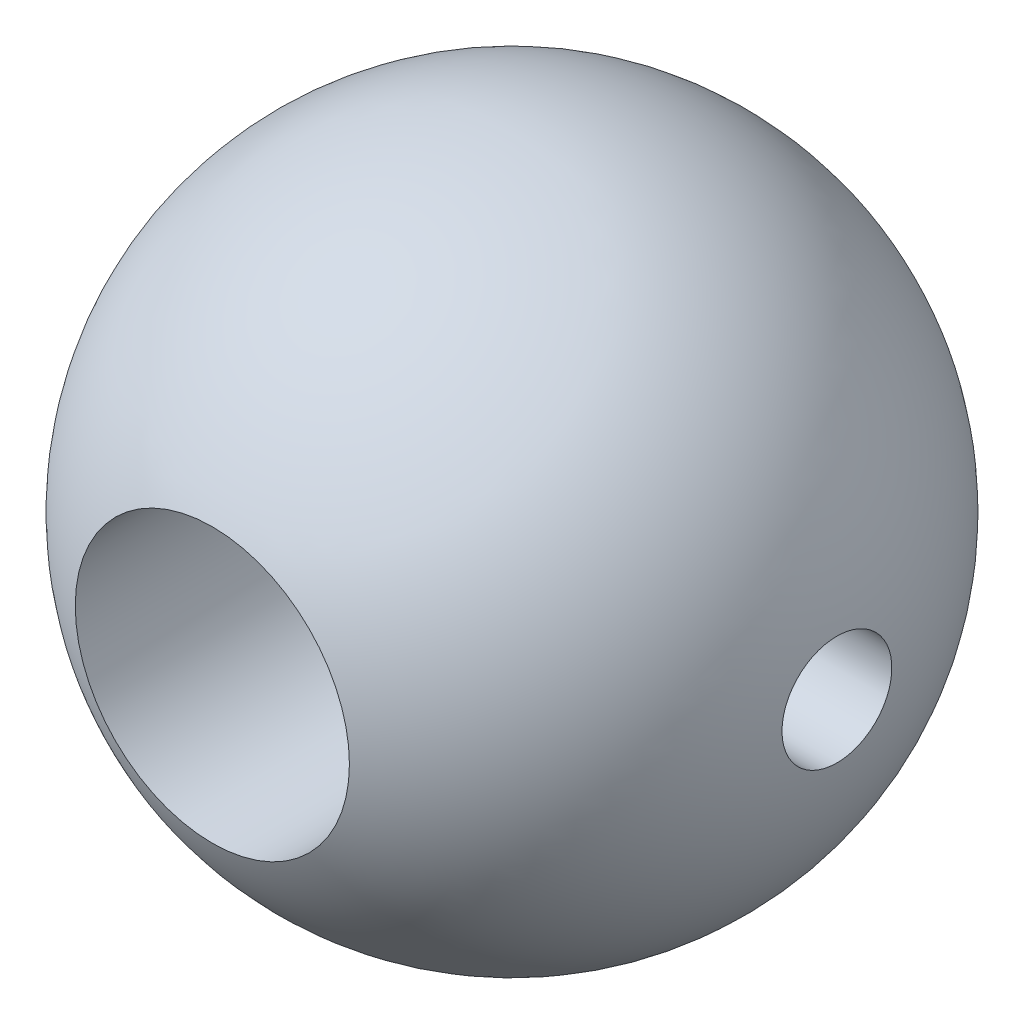
ISO-10303-21;
HEADER;
FILE_DESCRIPTION(('STEP AP214'),'2;1');
FILE_NAME('part.step','',(''),(''),'','','');
FILE_SCHEMA(('AUTOMOTIVE_DESIGN { 1 0 10303 214 1 1 1 1 }'));
ENDSEC;
DATA;
#1=APPLICATION_CONTEXT('core data for automotive mechanical design processes');
#2=APPLICATION_PROTOCOL_DEFINITION('international standard','automotive_design',2000,#1);
#3=PRODUCT_CONTEXT('',#1,'mechanical');
#4=PRODUCT('Part','Part','',(#3));
#5=PRODUCT_RELATED_PRODUCT_CATEGORY('part','',(#4));
#6=PRODUCT_DEFINITION_FORMATION('','',#4);
#7=PRODUCT_DEFINITION_CONTEXT('part definition',#1,'design');
#8=PRODUCT_DEFINITION('design','',#6,#7);
#9=PRODUCT_DEFINITION_SHAPE('','',#8);
#10=(LENGTH_UNIT() NAMED_UNIT(*) SI_UNIT(.MILLI.,.METRE.));
#11=(NAMED_UNIT(*) PLANE_ANGLE_UNIT() SI_UNIT($,.RADIAN.));
#12=(NAMED_UNIT(*) SI_UNIT($,.STERADIAN.) SOLID_ANGLE_UNIT());
#13=UNCERTAINTY_MEASURE_WITH_UNIT(LENGTH_MEASURE(1.E-05),#10,'distance_accuracy_value','');
#14=(GEOMETRIC_REPRESENTATION_CONTEXT(3) GLOBAL_UNCERTAINTY_ASSIGNED_CONTEXT((#13)) GLOBAL_UNIT_ASSIGNED_CONTEXT((#10,
#11,#12)) REPRESENTATION_CONTEXT('',''));
#15=CARTESIAN_POINT('',(0.,0.,0.));
#16=DIRECTION('',(0.,0.,1.));
#17=DIRECTION('',(1.,0.,0.));
#18=AXIS2_PLACEMENT_3D('',#15,#16,#17);
#19=CARTESIAN_POINT('',(0.,0.,0.));
#20=DIRECTION('',(0.,0.,-1.));
#21=DIRECTION('',(1.,0.,0.));
#22=AXIS2_PLACEMENT_3D('',#19,#20,#21);
#23=SPHERICAL_SURFACE('',#22,9.525);
#24=CARTESIAN_POINT('',(0.,0.,-8.66169794208965));
#25=DIRECTION('',(0.,0.,-1.));
#26=DIRECTION('',(-1.,0.,0.));
#27=AXIS2_PLACEMENT_3D('',#24,#25,#26);
#28=CIRCLE('',#27,3.9624);
#29=CARTESIAN_POINT('',(-3.9624,0.,-8.66169794208965));
#30=VERTEX_POINT('',#29);
#31=EDGE_CURVE('E10',#30,#30,#28,.T.);
#32=ORIENTED_EDGE('',*,*,#31,.F.);
#33=EDGE_LOOP('',(#32));
#34=FACE_BOUND('',#33,.T.);
#35=CARTESIAN_POINT('',(0.,0.,8.66169794208965));
#36=DIRECTION('',(0.,0.,-1.));
#37=DIRECTION('',(-1.,0.,0.));
#38=AXIS2_PLACEMENT_3D('',#35,#36,#37);
#39=CIRCLE('',#38,3.9624);
#40=CARTESIAN_POINT('',(-3.9624,0.,8.66169794208965));
#41=VERTEX_POINT('',#40);
#42=EDGE_CURVE('E48',#41,#41,#39,.T.);
#43=ORIENTED_EDGE('',*,*,#42,.T.);
#44=EDGE_LOOP('',(#43));
#45=FACE_BOUND('',#44,.T.);
#46=CARTESIAN_POINT('',(9.39177665567064,0.,0.));
#47=DIRECTION('',(-1.,0.,0.));
#48=DIRECTION('',(0.,0.,1.));
#49=AXIS2_PLACEMENT_3D('',#46,#47,#48);
#50=CIRCLE('',#49,1.5875);
#51=CARTESIAN_POINT('',(9.39177665567064,0.,1.5875));
#52=VERTEX_POINT('',#51);
#53=EDGE_CURVE('E87',#52,#52,#50,.F.);
#54=ORIENTED_EDGE('',*,*,#53,.F.);
#55=EDGE_LOOP('',(#54));
#56=FACE_BOUND('',#55,.T.);
#57=CARTESIAN_POINT('',(-9.39177665567064,0.,0.));
#58=DIRECTION('',(1.,0.,0.));
#59=DIRECTION('',(0.,0.,-1.));
#60=AXIS2_PLACEMENT_3D('',#57,#58,#59);
#61=CIRCLE('',#60,1.5875);
#62=CARTESIAN_POINT('',(-9.39177665567064,0.,-1.5875));
#63=VERTEX_POINT('',#62);
#64=EDGE_CURVE('E53',#63,#63,#61,.F.);
#65=ORIENTED_EDGE('',*,*,#64,.F.);
#66=EDGE_LOOP('',(#65));
#67=FACE_BOUND('',#66,.T.);
#68=ADVANCED_FACE('F37',(#34,#45,#56,#67),#23,.T.);
#69=CARTESIAN_POINT('',(0.,0.,-15.8555400958297));
#70=DIRECTION('',(0.,0.,-1.));
#71=DIRECTION('',(-1.,0.,0.));
#72=AXIS2_PLACEMENT_3D('',#69,#70,#71);
#73=CYLINDRICAL_SURFACE('',#72,3.9624);
#74=ORIENTED_EDGE('',*,*,#42,.F.);
#75=EDGE_LOOP('',(#74));
#76=FACE_BOUND('',#75,.T.);
#77=ORIENTED_EDGE('',*,*,#31,.T.);
#78=EDGE_LOOP('',(#77));
#79=FACE_BOUND('',#78,.T.);
#80=CARTESIAN_POINT('',(3.9624,0.,1.5875));
#81=CARTESIAN_POINT('',(3.96239416664373,0.0853117270718673,1.58749211930106));
#82=CARTESIAN_POINT('',(3.95961253187258,0.170771012783032,1.58058204726005));
#83=CARTESIAN_POINT('',(3.94875664272095,0.339280209794605,1.55318133192485));
#84=CARTESIAN_POINT('',(3.94066802223273,0.422322940365625,1.53265382430656));
#85=CARTESIAN_POINT('',(3.92006972049318,0.58328993969218,1.47888529051547));
#86=CARTESIAN_POINT('',(3.90757454272001,0.661230017057729,1.44568594252038));
#87=CARTESIAN_POINT('',(3.87939329710751,0.810363301587512,1.36768180814705));
#88=CARTESIAN_POINT('',(3.863708331934,0.881558827817698,1.32288103076507));
#89=CARTESIAN_POINT('',(3.82990464333274,1.01864732948285,1.22070983361455));
#90=CARTESIAN_POINT('',(3.81171021752443,1.08418010359647,1.16288133563253));
#91=CARTESIAN_POINT('',(3.7752829774358,1.20492218930694,1.03726313625752));
#92=CARTESIAN_POINT('',(3.75705014873227,1.26012643608792,0.969468576736823));
#93=CARTESIAN_POINT('',(3.72170442663272,1.36107386243811,0.822164437137005));
#94=CARTESIAN_POINT('',(3.70467796939796,1.40628412127964,0.742266770002608));
#95=CARTESIAN_POINT('',(3.67486086596433,1.4824632905671,0.57521696793719));
#96=CARTESIAN_POINT('',(3.66206820228051,1.51343898680089,0.488068313090151));
#97=CARTESIAN_POINT('',(3.64298009307872,1.55881183659324,0.313129379937859));
#98=CARTESIAN_POINT('',(3.63641570103485,1.57389868874412,0.225548405103389));
#99=CARTESIAN_POINT('',(3.62974807106188,1.58921987839996,0.0488708701643141));
#100=CARTESIAN_POINT('',(3.62964164180919,1.58946155192944,-0.040224919591401));
#101=CARTESIAN_POINT('',(3.6356726055801,1.575608087631,-0.210765770593199));
#102=CARTESIAN_POINT('',(3.64137433896396,1.56251330699092,-0.292310497958319));
#103=CARTESIAN_POINT('',(3.65764778306397,1.5240270084585,-0.451929975312635));
#104=CARTESIAN_POINT('',(3.66822034656052,1.49863333724794,-0.530004115048953));
#105=CARTESIAN_POINT('',(3.69327658525766,1.43578621930772,-0.682353002714172));
#106=CARTESIAN_POINT('',(3.7078358006729,1.39809683496274,-0.756517443579268));
#107=CARTESIAN_POINT('',(3.73920425029953,1.31189385068063,-0.897742356999457));
#108=CARTESIAN_POINT('',(3.7560143303144,1.26337617722401,-0.964800142046522));
#109=CARTESIAN_POINT('',(3.79157859533404,1.15247025125588,-1.09538227966191));
#110=CARTESIAN_POINT('',(3.81038243478568,1.08929797701747,-1.15822901314648));
#111=CARTESIAN_POINT('',(3.84670714404859,0.953110948774043,-1.272653703119));
#112=CARTESIAN_POINT('',(3.86422775624386,0.880094226746657,-1.32422940097552));
#113=CARTESIAN_POINT('',(3.89645338462923,0.724363732588358,-1.41554113785356));
#114=CARTESIAN_POINT('',(3.91109551133595,0.64148605770065,-1.45502145644826));
#115=CARTESIAN_POINT('',(3.93543864002888,0.469530085969014,-1.51924620789086));
#116=CARTESIAN_POINT('',(3.94514216003095,0.380454975359992,-1.54399815129254));
#117=CARTESIAN_POINT('',(3.95805539170234,0.204311847288935,-1.57669128161821));
#118=CARTESIAN_POINT('',(3.96161635318635,0.117438504602531,-1.5855430577553));
#119=CARTESIAN_POINT('',(3.96295024554236,-0.0566169135851256,-1.58887432761563));
#120=CARTESIAN_POINT('',(3.96072468264189,-0.143798902846544,-1.58335756145793));
#121=CARTESIAN_POINT('',(3.95096541555837,-0.311864203819768,-1.55877721223898));
#122=CARTESIAN_POINT('',(3.94367566936803,-0.392854247186953,-1.54033589846701));
#123=CARTESIAN_POINT('',(3.92477456539392,-0.550515216479774,-1.4912773776295));
#124=CARTESIAN_POINT('',(3.9131626527772,-0.627185586437011,-1.4606586073193));
#125=CARTESIAN_POINT('',(3.88630174678253,-0.776671825040637,-1.3871152245476));
#126=CARTESIAN_POINT('',(3.87095230097636,-0.849297865243659,-1.34384261411414));
#127=CARTESIAN_POINT('',(3.83827939599824,-0.986513042497236,-1.24660586359978));
#128=CARTESIAN_POINT('',(3.82095514553132,-1.05109893605944,-1.19263743131032));
#129=CARTESIAN_POINT('',(3.78479622435235,-1.17488814946077,-1.071349564643));
#130=CARTESIAN_POINT('',(3.76593750910618,-1.23345169378678,-1.00338262689443));
#131=CARTESIAN_POINT('',(3.72989598565993,-1.3384999511022,-0.858253679288922));
#132=CARTESIAN_POINT('',(3.71271345763365,-1.38498264693782,-0.781090136997126));
#133=CARTESIAN_POINT('',(3.68194013043205,-1.46485133239264,-0.6185783852232));
#134=CARTESIAN_POINT('',(3.66838637510373,-1.4981038159132,-0.533157046377296));
#135=CARTESIAN_POINT('',(3.64698112621987,-1.5494941460913,-0.357220223057035));
#136=CARTESIAN_POINT('',(3.63912540623532,-1.56764319695997,-0.266708568053325));
#137=CARTESIAN_POINT('',(3.63061804319505,-1.58723971665742,-0.0901981792953822));
#138=CARTESIAN_POINT('',(3.62948746901891,-1.58979784556331,-0.00434507943623427));
#139=CARTESIAN_POINT('',(3.63330307077313,-1.58105828726621,0.16650668272671));
#140=CARTESIAN_POINT('',(3.63824846948727,-1.56976237222211,0.251505452911166));
#141=CARTESIAN_POINT('',(3.65323574640426,-1.53454341699213,0.414768882336901));
#142=CARTESIAN_POINT('',(3.66306695290778,-1.51114082490252,0.493166917752752));
#143=CARTESIAN_POINT('',(3.6865691443393,-1.45286057138561,0.644954659742315));
#144=CARTESIAN_POINT('',(3.70024119029212,-1.41797973865852,0.718342975417014));
#145=CARTESIAN_POINT('',(3.73085856653309,-1.3354212120285,0.862615526604617));
#146=CARTESIAN_POINT('',(3.74794669035746,-1.28712414414707,0.933114531596546));
#147=CARTESIAN_POINT('',(3.78303688506397,-1.18000808273821,1.0653557778298));
#148=CARTESIAN_POINT('',(3.80103923183971,-1.12118589927164,1.12709535407475));
#149=CARTESIAN_POINT('',(3.83733892894263,-0.990129236409028,1.24419200221078));
#150=CARTESIAN_POINT('',(3.85557912432534,-0.91727072158657,1.29887145882592));
#151=CARTESIAN_POINT('',(3.88910173721633,-0.762721357089437,1.39524279467017));
#152=CARTESIAN_POINT('',(3.90438277937339,-0.681026427799037,1.43692864020734));
#153=CARTESIAN_POINT('',(3.93000833052496,-0.512612293189793,1.50515468741471));
#154=CARTESIAN_POINT('',(3.94043917717235,-0.426014442405737,1.53196156880167));
#155=CARTESIAN_POINT('',(3.95554325966712,-0.249201615949017,1.57040986772659));
#156=CARTESIAN_POINT('',(3.96023475540089,-0.158999059586053,1.58209938833736));
#157=CARTESIAN_POINT('',(3.96220361378713,-0.0457330899803863,1.58700812237842));
#158=CARTESIAN_POINT('',(3.96240156390736,-0.022871847966529,1.5875021127945));
#159=CARTESIAN_POINT('',(3.9624,0.,1.5875));
#160=B_SPLINE_CURVE_WITH_KNOTS('',3,(#80,#81,#82,#83,#84,#85,#86,#87,#88,#89,#90,#91,#92,#93,
#94,#95,#96,#97,#98,#99,#100,#101,#102,#103,#104,#105,#106,#107,#108,#109,#110,#111,#112,#113,
#114,#115,#116,#117,#118,#119,#120,#121,#122,#123,#124,#125,#126,#127,#128,#129,#130,#131,#132,
#133,#134,#135,#136,#137,#138,#139,#140,#141,#142,#143,#144,#145,#146,#147,#148,#149,#150,#151,
#152,#153,#154,#155,#156,#157,#158,#159),.UNSPECIFIED.,.T.,.F.,(4,2,2,2,2,2,2,2,2,2,2,2,2,2,2,2,
2,2,2,2,2,2,2,2,2,2,2,2,2,2,2,2,2,2,2,2,2,2,2,4),(0.,0.255873929494163,0.512443388183724,
0.768176151866853,1.02382066204938,1.2904702136267,1.55725018179778,1.8359498024818,
2.11451642551445,2.38041834160662,2.646188856203,2.89339325556369,3.1406409516974,
3.39294340285309,3.64534092872686,3.9173176007395,4.1893487249715,4.46678713369948,
4.74408394461069,5.00492203806862,5.26569224238361,5.51470010088076,5.76373993534178,
6.02040300035023,6.27716927297268,6.55094094110412,6.82475829189516,7.1012726199954,
7.37758163757344,7.63395264349523,7.89029085879074,8.1364269015365,8.38263100588646,
8.64296045355352,8.90336893560795,9.18073833868855,9.45823634935123,9.73058529806196,
10.0020654893605,10.0706646118358),.UNSPECIFIED.);
#161=CARTESIAN_POINT('',(3.9624,0.,1.5875));
#162=VERTEX_POINT('',#161);
#163=EDGE_CURVE('E56',#162,#162,#160,.T.);
#164=ORIENTED_EDGE('',*,*,#163,.F.);
#165=EDGE_LOOP('',(#164));
#166=FACE_BOUND('',#165,.T.);
#167=CARTESIAN_POINT('',(-3.9624,0.,1.5875));
#168=CARTESIAN_POINT('',(-3.96239416664373,-0.0853117270718673,1.58749211930106));
#169=CARTESIAN_POINT('',(-3.95961253187258,-0.170771012783032,1.58058204726005));
#170=CARTESIAN_POINT('',(-3.94875664272095,-0.339280209794605,1.55318133192485));
#171=CARTESIAN_POINT('',(-3.94066802223273,-0.422322940365625,1.53265382430656));
#172=CARTESIAN_POINT('',(-3.92006972049318,-0.58328993969218,1.47888529051547));
#173=CARTESIAN_POINT('',(-3.90757454272001,-0.661230017057729,1.44568594252038));
#174=CARTESIAN_POINT('',(-3.87939329710751,-0.810363301587512,1.36768180814705));
#175=CARTESIAN_POINT('',(-3.863708331934,-0.881558827817698,1.32288103076507));
#176=CARTESIAN_POINT('',(-3.82990464333274,-1.01864732948285,1.22070983361455));
#177=CARTESIAN_POINT('',(-3.81171021752443,-1.08418010359647,1.16288133563253));
#178=CARTESIAN_POINT('',(-3.7752829774358,-1.20492218930694,1.03726313625752));
#179=CARTESIAN_POINT('',(-3.75705014873227,-1.26012643608792,0.969468576736823));
#180=CARTESIAN_POINT('',(-3.72170442663272,-1.36107386243811,0.822164437137005));
#181=CARTESIAN_POINT('',(-3.70467796939796,-1.40628412127964,0.742266770002608));
#182=CARTESIAN_POINT('',(-3.67486086596433,-1.4824632905671,0.57521696793719));
#183=CARTESIAN_POINT('',(-3.66206820228051,-1.51343898680089,0.488068313090151));
#184=CARTESIAN_POINT('',(-3.64298009307872,-1.55881183659324,0.313129379937859));
#185=CARTESIAN_POINT('',(-3.63641570103485,-1.57389868874412,0.225548405103389));
#186=CARTESIAN_POINT('',(-3.62974807106188,-1.58921987839996,0.0488708701643141));
#187=CARTESIAN_POINT('',(-3.62964164180919,-1.58946155192944,-0.040224919591401));
#188=CARTESIAN_POINT('',(-3.6356726055801,-1.575608087631,-0.210765770593199));
#189=CARTESIAN_POINT('',(-3.64137433896396,-1.56251330699092,-0.292310497958319));
#190=CARTESIAN_POINT('',(-3.65764778306397,-1.5240270084585,-0.451929975312635));
#191=CARTESIAN_POINT('',(-3.66822034656052,-1.49863333724794,-0.530004115048953));
#192=CARTESIAN_POINT('',(-3.69327658525766,-1.43578621930772,-0.682353002714172));
#193=CARTESIAN_POINT('',(-3.7078358006729,-1.39809683496274,-0.756517443579268));
#194=CARTESIAN_POINT('',(-3.73920425029953,-1.31189385068063,-0.897742356999457));
#195=CARTESIAN_POINT('',(-3.7560143303144,-1.26337617722401,-0.964800142046522));
#196=CARTESIAN_POINT('',(-3.79157859533404,-1.15247025125588,-1.09538227966191));
#197=CARTESIAN_POINT('',(-3.81038243478568,-1.08929797701747,-1.15822901314648));
#198=CARTESIAN_POINT('',(-3.84670714404859,-0.953110948774043,-1.272653703119));
#199=CARTESIAN_POINT('',(-3.86422775624386,-0.880094226746657,-1.32422940097552));
#200=CARTESIAN_POINT('',(-3.89645338462923,-0.724363732588358,-1.41554113785356));
#201=CARTESIAN_POINT('',(-3.91109551133595,-0.64148605770065,-1.45502145644826));
#202=CARTESIAN_POINT('',(-3.93543864002888,-0.469530085969014,-1.51924620789086));
#203=CARTESIAN_POINT('',(-3.94514216003095,-0.380454975359992,-1.54399815129254));
#204=CARTESIAN_POINT('',(-3.95805539170234,-0.204311847288935,-1.57669128161821));
#205=CARTESIAN_POINT('',(-3.96161635318635,-0.117438504602531,-1.5855430577553));
#206=CARTESIAN_POINT('',(-3.96295024554236,0.0566169135851256,-1.58887432761563));
#207=CARTESIAN_POINT('',(-3.96072468264189,0.143798902846544,-1.58335756145793));
#208=CARTESIAN_POINT('',(-3.95096541555837,0.311864203819768,-1.55877721223898));
#209=CARTESIAN_POINT('',(-3.94367566936803,0.392854247186953,-1.54033589846701));
#210=CARTESIAN_POINT('',(-3.92477456539392,0.550515216479774,-1.4912773776295));
#211=CARTESIAN_POINT('',(-3.9131626527772,0.627185586437011,-1.4606586073193));
#212=CARTESIAN_POINT('',(-3.88630174678253,0.776671825040637,-1.3871152245476));
#213=CARTESIAN_POINT('',(-3.87095230097636,0.849297865243659,-1.34384261411414));
#214=CARTESIAN_POINT('',(-3.83827939599824,0.986513042497236,-1.24660586359978));
#215=CARTESIAN_POINT('',(-3.82095514553132,1.05109893605944,-1.19263743131032));
#216=CARTESIAN_POINT('',(-3.78479622435235,1.17488814946077,-1.071349564643));
#217=CARTESIAN_POINT('',(-3.76593750910618,1.23345169378678,-1.00338262689443));
#218=CARTESIAN_POINT('',(-3.72989598565993,1.3384999511022,-0.858253679288922));
#219=CARTESIAN_POINT('',(-3.71271345763365,1.38498264693782,-0.781090136997126));
#220=CARTESIAN_POINT('',(-3.68194013043205,1.46485133239264,-0.6185783852232));
#221=CARTESIAN_POINT('',(-3.66838637510373,1.4981038159132,-0.533157046377296));
#222=CARTESIAN_POINT('',(-3.64698112621987,1.5494941460913,-0.357220223057035));
#223=CARTESIAN_POINT('',(-3.63912540623532,1.56764319695997,-0.266708568053325));
#224=CARTESIAN_POINT('',(-3.63061804319505,1.58723971665742,-0.0901981792953822));
#225=CARTESIAN_POINT('',(-3.62948746901891,1.58979784556331,-0.00434507943623427));
#226=CARTESIAN_POINT('',(-3.63330307077313,1.58105828726621,0.16650668272671));
#227=CARTESIAN_POINT('',(-3.63824846948727,1.56976237222211,0.251505452911166));
#228=CARTESIAN_POINT('',(-3.65323574640426,1.53454341699213,0.414768882336901));
#229=CARTESIAN_POINT('',(-3.66306695290778,1.51114082490252,0.493166917752752));
#230=CARTESIAN_POINT('',(-3.6865691443393,1.45286057138561,0.644954659742315));
#231=CARTESIAN_POINT('',(-3.70024119029212,1.41797973865852,0.718342975417014));
#232=CARTESIAN_POINT('',(-3.73085856653309,1.3354212120285,0.862615526604617));
#233=CARTESIAN_POINT('',(-3.74794669035746,1.28712414414707,0.933114531596546));
#234=CARTESIAN_POINT('',(-3.78303688506397,1.18000808273821,1.0653557778298));
#235=CARTESIAN_POINT('',(-3.80103923183971,1.12118589927164,1.12709535407475));
#236=CARTESIAN_POINT('',(-3.83733892894263,0.990129236409028,1.24419200221078));
#237=CARTESIAN_POINT('',(-3.85557912432534,0.91727072158657,1.29887145882592));
#238=CARTESIAN_POINT('',(-3.88910173721633,0.762721357089437,1.39524279467017));
#239=CARTESIAN_POINT('',(-3.90438277937339,0.681026427799037,1.43692864020734));
#240=CARTESIAN_POINT('',(-3.93000833052496,0.512612293189793,1.50515468741471));
#241=CARTESIAN_POINT('',(-3.94043917717235,0.426014442405737,1.53196156880167));
#242=CARTESIAN_POINT('',(-3.95554325966712,0.249201615949017,1.57040986772659));
#243=CARTESIAN_POINT('',(-3.96023475540089,0.158999059586053,1.58209938833736));
#244=CARTESIAN_POINT('',(-3.96220361378713,0.0457330899803863,1.58700812237842));
#245=CARTESIAN_POINT('',(-3.96240156390736,0.022871847966529,1.5875021127945));
#246=CARTESIAN_POINT('',(-3.9624,0.,1.5875));
#247=B_SPLINE_CURVE_WITH_KNOTS('',3,(#167,#168,#169,#170,#171,#172,#173,#174,#175,#176,#177,
#178,#179,#180,#181,#182,#183,#184,#185,#186,#187,#188,#189,#190,#191,#192,#193,#194,#195,#196,
#197,#198,#199,#200,#201,#202,#203,#204,#205,#206,#207,#208,#209,#210,#211,#212,#213,#214,#215,
#216,#217,#218,#219,#220,#221,#222,#223,#224,#225,#226,#227,#228,#229,#230,#231,#232,#233,#234,
#235,#236,#237,#238,#239,#240,#241,#242,#243,#244,#245,#246),.UNSPECIFIED.,.T.,.F.,(4,2,2,2,2,2,
2,2,2,2,2,2,2,2,2,2,2,2,2,2,2,2,2,2,2,2,2,2,2,2,2,2,2,2,2,2,2,2,2,4),(0.,0.255873929494163,
0.512443388183724,0.768176151866853,1.02382066204938,1.2904702136267,1.55725018179778,
1.8359498024818,2.11451642551445,2.38041834160662,2.646188856203,2.89339325556369,
3.1406409516974,3.39294340285309,3.64534092872686,3.9173176007395,4.1893487249715,
4.46678713369948,4.74408394461069,5.00492203806862,5.26569224238361,5.51470010088076,
5.76373993534178,6.02040300035023,6.27716927297268,6.55094094110412,6.82475829189516,
7.1012726199954,7.37758163757344,7.63395264349523,7.89029085879074,8.1364269015365,
8.38263100588646,8.64296045355352,8.90336893560795,9.18073833868855,9.45823634935123,
9.73058529806196,10.0020654893605,10.0706646118358),.UNSPECIFIED.);
#248=CARTESIAN_POINT('',(-3.9624,0.,1.5875));
#249=VERTEX_POINT('',#248);
#250=EDGE_CURVE('E40',#249,#249,#247,.T.);
#251=ORIENTED_EDGE('',*,*,#250,.F.);
#252=EDGE_LOOP('',(#251));
#253=FACE_BOUND('',#252,.T.);
#254=ADVANCED_FACE('F61',(#76,#79,#166,#253),#73,.F.);
#255=CARTESIAN_POINT('',(-13.1037108095683,0.,0.));
#256=DIRECTION('',(-1.,0.,0.));
#257=DIRECTION('',(0.,0.,1.));
#258=AXIS2_PLACEMENT_3D('',#255,#256,#257);
#259=CYLINDRICAL_SURFACE('',#258,1.5875);
#260=ORIENTED_EDGE('',*,*,#163,.T.);
#261=EDGE_LOOP('',(#260));
#262=FACE_BOUND('',#261,.T.);
#263=ORIENTED_EDGE('',*,*,#53,.T.);
#264=EDGE_LOOP('',(#263));
#265=FACE_BOUND('',#264,.T.);
#266=ADVANCED_FACE('F66',(#262,#265),#259,.F.);
#267=ORIENTED_EDGE('',*,*,#250,.T.);
#268=EDGE_LOOP('',(#267));
#269=FACE_BOUND('',#268,.T.);
#270=ORIENTED_EDGE('',*,*,#64,.T.);
#271=EDGE_LOOP('',(#270));
#272=FACE_BOUND('',#271,.T.);
#273=ADVANCED_FACE('F63',(#269,#272),#259,.F.);
#274=CLOSED_SHELL('',(#68,#254,#266,#273));
#275=MANIFOLD_SOLID_BREP('B2',#274);
#276=ADVANCED_BREP_SHAPE_REPRESENTATION('',(#18,#275),#14);
#277=SHAPE_DEFINITION_REPRESENTATION(#9,#276);
ENDSEC;
END-ISO-10303-21;
